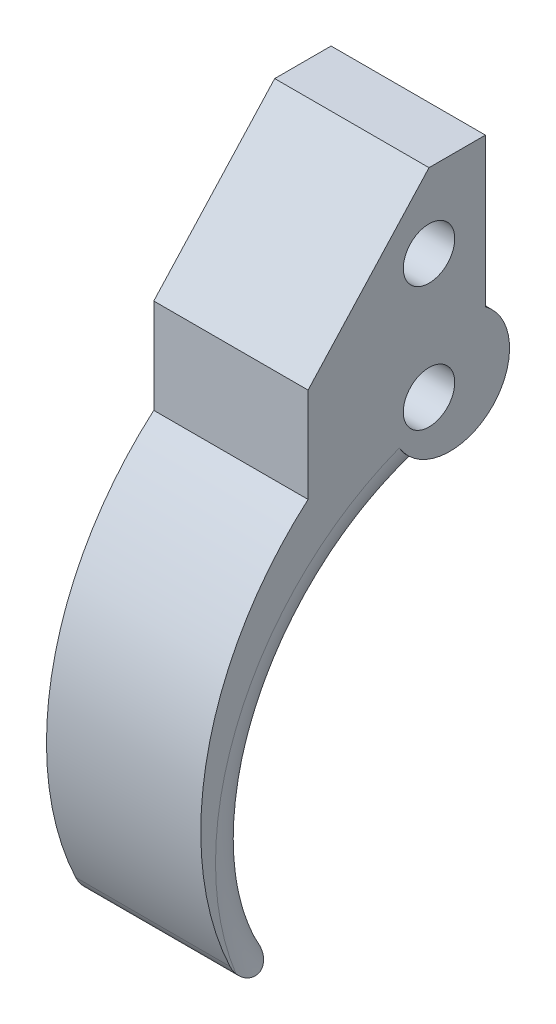
ISO-10303-21;
HEADER;
FILE_DESCRIPTION(('STEP AP214'),'2;1');
FILE_NAME('part.step','',(''),(''),'','','');
FILE_SCHEMA(('AUTOMOTIVE_DESIGN { 1 0 10303 214 1 1 1 1 }'));
ENDSEC;
DATA;
#1=APPLICATION_CONTEXT('core data for automotive mechanical design processes');
#2=APPLICATION_PROTOCOL_DEFINITION('international standard','automotive_design',2000,#1);
#3=PRODUCT_CONTEXT('',#1,'mechanical');
#4=PRODUCT('Part','Part','',(#3));
#5=PRODUCT_RELATED_PRODUCT_CATEGORY('part','',(#4));
#6=PRODUCT_DEFINITION_FORMATION('','',#4);
#7=PRODUCT_DEFINITION_CONTEXT('part definition',#1,'design');
#8=PRODUCT_DEFINITION('design','',#6,#7);
#9=PRODUCT_DEFINITION_SHAPE('','',#8);
#10=(LENGTH_UNIT() NAMED_UNIT(*) SI_UNIT(.MILLI.,.METRE.));
#11=(NAMED_UNIT(*) PLANE_ANGLE_UNIT() SI_UNIT($,.RADIAN.));
#12=(NAMED_UNIT(*) SI_UNIT($,.STERADIAN.) SOLID_ANGLE_UNIT());
#13=UNCERTAINTY_MEASURE_WITH_UNIT(LENGTH_MEASURE(1.E-05),#10,'distance_accuracy_value','');
#14=(GEOMETRIC_REPRESENTATION_CONTEXT(3) GLOBAL_UNCERTAINTY_ASSIGNED_CONTEXT((#13)) GLOBAL_UNIT_ASSIGNED_CONTEXT((#10,
#11,#12)) REPRESENTATION_CONTEXT('',''));
#15=CARTESIAN_POINT('',(0.,0.,0.));
#16=DIRECTION('',(0.,0.,1.));
#17=DIRECTION('',(1.,0.,0.));
#18=AXIS2_PLACEMENT_3D('',#15,#16,#17);
#19=CARTESIAN_POINT('',(9.144,0.406088351333503,-1.5095298454013));
#20=DIRECTION('',(-1.,0.,0.));
#21=DIRECTION('',(0.,0.,1.));
#22=AXIS2_PLACEMENT_3D('',#19,#20,#21);
#23=PLANE('',#22);
#24=CARTESIAN_POINT('',(9.144,-15.2659930238137,-5.07261330783147));
#25=DIRECTION('',(1.,0.,0.));
#26=DIRECTION('',(0.,0.,1.));
#27=AXIS2_PLACEMENT_3D('',#24,#25,#26);
#28=CIRCLE('',#27,18.3267874547555);
#29=CARTESIAN_POINT('',(9.144,-1.38815503928204,6.89721339462647));
#30=VERTEX_POINT('',#29);
#31=CARTESIAN_POINT('',(9.144,-23.0426955231033,11.5223870431576));
#32=VERTEX_POINT('',#31);
#33=EDGE_CURVE('E214',#30,#32,#28,.T.);
#34=ORIENTED_EDGE('',*,*,#33,.T.);
#35=CARTESIAN_POINT('',(9.144,-21.9648839100772,9.22240397217075));
#36=DIRECTION('',(-1.,0.,0.));
#37=DIRECTION('',(0.,0.,1.));
#38=AXIS2_PLACEMENT_3D('',#35,#36,#37);
#39=CIRCLE('',#38,2.54);
#40=CARTESIAN_POINT('',(9.144,-23.5895098556666,11.1748871441643));
#41=VERTEX_POINT('',#40);
#42=EDGE_CURVE('E159',#32,#41,#39,.F.);
#43=ORIENTED_EDGE('',*,*,#42,.T.);
#44=CARTESIAN_POINT('',(9.144,-17.3011498885334,-4.60291576796969));
#45=DIRECTION('',(-1.,0.,0.));
#46=DIRECTION('',(0.,0.,1.));
#47=AXIS2_PLACEMENT_3D('',#44,#45,#46);
#48=CIRCLE('',#47,16.9847736461334);
#49=CARTESIAN_POINT('',(9.144,-1.44900987596194,1.49562445344551));
#50=VERTEX_POINT('',#49);
#51=EDGE_CURVE('E141',#41,#50,#48,.T.);
#52=ORIENTED_EDGE('',*,*,#51,.T.);
#53=CARTESIAN_POINT('',(9.144,0.406088351333503,-1.5095298454013));
#54=DIRECTION('',(1.,0.,0.));
#55=DIRECTION('',(0.,0.,1.));
#56=AXIS2_PLACEMENT_3D('',#53,#54,#55);
#57=CIRCLE('',#56,3.53162027868119);
#58=CARTESIAN_POINT('',(9.144,3.24535103212137,-3.60975107714749));
#59=VERTEX_POINT('',#58);
#60=EDGE_CURVE('E135',#50,#59,#57,.T.);
#61=ORIENTED_EDGE('',*,*,#60,.T.);
#62=DIRECTION('',(0.,1.,0.));
#63=VECTOR('',#62,1.);
#64=CARTESIAN_POINT('',(9.144,12.0555386326772,-3.60975107714749));
#65=LINE('',#64,#63);
#66=CARTESIAN_POINT('',(9.144,12.0555386326772,-3.60975107714749));
#67=VERTEX_POINT('',#66);
#68=EDGE_CURVE('E124',#59,#67,#65,.T.);
#69=ORIENTED_EDGE('',*,*,#68,.T.);
#70=DIRECTION('',(0.,0.,1.));
#71=VECTOR('',#70,1.);
#72=CARTESIAN_POINT('',(9.144,12.0555386326772,-0.268270981163696));
#73=LINE('',#72,#71);
#74=CARTESIAN_POINT('',(9.144,12.0555386326772,-0.268270981163696));
#75=VERTEX_POINT('',#74);
#76=EDGE_CURVE('E134',#67,#75,#73,.T.);
#77=ORIENTED_EDGE('',*,*,#76,.T.);
#78=DIRECTION('',(0.,-0.737772650689594,0.67504926923481));
#79=VECTOR('',#78,1.);
#80=CARTESIAN_POINT('',(9.144,4.22426076551646,6.89721339462647));
#81=LINE('',#80,#79);
#82=CARTESIAN_POINT('',(9.144,4.22426076551646,6.89721339462647));
#83=VERTEX_POINT('',#82);
#84=EDGE_CURVE('E210',#75,#83,#81,.T.);
#85=ORIENTED_EDGE('',*,*,#84,.T.);
#86=DIRECTION('',(0.,-1.,0.));
#87=VECTOR('',#86,1.);
#88=CARTESIAN_POINT('',(9.144,-1.38815503928204,6.89721339462647));
#89=LINE('',#88,#87);
#90=EDGE_CURVE('E212',#83,#30,#89,.T.);
#91=ORIENTED_EDGE('',*,*,#90,.T.);
#92=EDGE_LOOP('',(#34,#43,#52,#61,#69,#77,#85,#91));
#93=FACE_BOUND('',#92,.T.);
#94=CARTESIAN_POINT('',(9.144,0.274790235043502,-0.268270981163696));
#95=DIRECTION('',(1.,0.,0.));
#96=DIRECTION('',(0.,0.,-1.));
#97=AXIS2_PLACEMENT_3D('',#94,#95,#96);
#98=CIRCLE('',#97,1.524);
#99=CARTESIAN_POINT('',(9.144,0.274790235043502,-1.79227098116369));
#100=VERTEX_POINT('',#99);
#101=EDGE_CURVE('E204',#100,#100,#98,.T.);
#102=ORIENTED_EDGE('',*,*,#101,.F.);
#103=EDGE_LOOP('',(#102));
#104=FACE_BOUND('',#103,.T.);
#105=CARTESIAN_POINT('',(9.144,7.65044483239927,-0.268270981163696));
#106=DIRECTION('',(1.,0.,0.));
#107=DIRECTION('',(0.,0.,-1.));
#108=AXIS2_PLACEMENT_3D('',#105,#106,#107);
#109=CIRCLE('',#108,1.524);
#110=CARTESIAN_POINT('',(9.144,7.65044483239927,-1.79227098116369));
#111=VERTEX_POINT('',#110);
#112=EDGE_CURVE('E196',#111,#111,#109,.T.);
#113=ORIENTED_EDGE('',*,*,#112,.F.);
#114=EDGE_LOOP('',(#113));
#115=FACE_BOUND('',#114,.T.);
#116=ADVANCED_FACE('F40',(#93,#104,#115),#23,.F.);
#117=CARTESIAN_POINT('',(0.,0.406088351333503,-1.5095298454013));
#118=DIRECTION('',(-1.,0.,0.));
#119=DIRECTION('',(0.,0.,1.));
#120=AXIS2_PLACEMENT_3D('',#117,#118,#119);
#121=PLANE('',#120);
#122=CARTESIAN_POINT('',(0.,0.274790235043502,-0.268270981163696));
#123=DIRECTION('',(1.,0.,0.));
#124=DIRECTION('',(0.,0.,-1.));
#125=AXIS2_PLACEMENT_3D('',#122,#123,#124);
#126=CIRCLE('',#125,1.524);
#127=CARTESIAN_POINT('',(0.,0.274790235043502,-1.79227098116369));
#128=VERTEX_POINT('',#127);
#129=EDGE_CURVE('E201',#128,#128,#126,.T.);
#130=ORIENTED_EDGE('',*,*,#129,.T.);
#131=EDGE_LOOP('',(#130));
#132=FACE_BOUND('',#131,.T.);
#133=CARTESIAN_POINT('',(0.,-17.3011498885334,-4.60291576796969));
#134=DIRECTION('',(-1.,0.,0.));
#135=DIRECTION('',(0.,0.,1.));
#136=AXIS2_PLACEMENT_3D('',#133,#134,#135);
#137=CIRCLE('',#136,16.9847736461334);
#138=CARTESIAN_POINT('',(0.,-1.44900987596194,1.49562445344551));
#139=VERTEX_POINT('',#138);
#140=CARTESIAN_POINT('',(0.,-23.5895098556666,11.1748871441643));
#141=VERTEX_POINT('',#140);
#142=EDGE_CURVE('E147',#139,#141,#137,.F.);
#143=ORIENTED_EDGE('',*,*,#142,.T.);
#144=CARTESIAN_POINT('',(0.,-21.9648839100772,9.22240397217075));
#145=DIRECTION('',(-1.,0.,0.));
#146=DIRECTION('',(0.,0.,1.));
#147=AXIS2_PLACEMENT_3D('',#144,#145,#146);
#148=CIRCLE('',#147,2.54);
#149=CARTESIAN_POINT('',(0.,-23.0426955231033,11.5223870431576));
#150=VERTEX_POINT('',#149);
#151=EDGE_CURVE('E149',#141,#150,#148,.T.);
#152=ORIENTED_EDGE('',*,*,#151,.T.);
#153=CARTESIAN_POINT('',(0.,-15.2659930238137,-5.07261330783147));
#154=DIRECTION('',(1.,0.,0.));
#155=DIRECTION('',(0.,0.,1.));
#156=AXIS2_PLACEMENT_3D('',#153,#154,#155);
#157=CIRCLE('',#156,18.3267874547555);
#158=CARTESIAN_POINT('',(0.,-1.38815503928204,6.89721339462647));
#159=VERTEX_POINT('',#158);
#160=EDGE_CURVE('E142',#159,#150,#157,.T.);
#161=ORIENTED_EDGE('',*,*,#160,.F.);
#162=DIRECTION('',(0.,-1.,0.));
#163=VECTOR('',#162,1.);
#164=CARTESIAN_POINT('',(0.,-1.38815503928204,6.89721339462647));
#165=LINE('',#164,#163);
#166=CARTESIAN_POINT('',(0.,4.22426076551646,6.89721339462647));
#167=VERTEX_POINT('',#166);
#168=EDGE_CURVE('E224',#167,#159,#165,.T.);
#169=ORIENTED_EDGE('',*,*,#168,.F.);
#170=DIRECTION('',(0.,-0.737772650689594,0.67504926923481));
#171=VECTOR('',#170,1.);
#172=CARTESIAN_POINT('',(0.,4.22426076551646,6.89721339462647));
#173=LINE('',#172,#171);
#174=CARTESIAN_POINT('',(0.,12.0555386326772,-0.268270981163696));
#175=VERTEX_POINT('',#174);
#176=EDGE_CURVE('E222',#175,#167,#173,.T.);
#177=ORIENTED_EDGE('',*,*,#176,.F.);
#178=DIRECTION('',(0.,0.,1.));
#179=VECTOR('',#178,1.);
#180=CARTESIAN_POINT('',(0.,12.0555386326772,-0.268270981163696));
#181=LINE('',#180,#179);
#182=CARTESIAN_POINT('',(0.,12.0555386326772,-3.60975107714749));
#183=VERTEX_POINT('',#182);
#184=EDGE_CURVE('E220',#183,#175,#181,.T.);
#185=ORIENTED_EDGE('',*,*,#184,.F.);
#186=DIRECTION('',(0.,1.,0.));
#187=VECTOR('',#186,1.);
#188=CARTESIAN_POINT('',(0.,12.0555386326772,-3.60975107714749));
#189=LINE('',#188,#187);
#190=CARTESIAN_POINT('',(0.,3.24535103212137,-3.60975107714749));
#191=VERTEX_POINT('',#190);
#192=EDGE_CURVE('E218',#191,#183,#189,.T.);
#193=ORIENTED_EDGE('',*,*,#192,.F.);
#194=CARTESIAN_POINT('',(0.,0.406088351333503,-1.5095298454013));
#195=DIRECTION('',(1.,0.,0.));
#196=DIRECTION('',(0.,0.,1.));
#197=AXIS2_PLACEMENT_3D('',#194,#195,#196);
#198=CIRCLE('',#197,3.53162027868119);
#199=EDGE_CURVE('E146',#139,#191,#198,.T.);
#200=ORIENTED_EDGE('',*,*,#199,.F.);
#201=EDGE_LOOP('',(#143,#152,#161,#169,#177,#185,#193,#200));
#202=FACE_BOUND('',#201,.T.);
#203=CARTESIAN_POINT('',(0.,7.65044483239927,-0.268270981163696));
#204=DIRECTION('',(1.,0.,0.));
#205=DIRECTION('',(0.,0.,-1.));
#206=AXIS2_PLACEMENT_3D('',#203,#204,#205);
#207=CIRCLE('',#206,1.524);
#208=CARTESIAN_POINT('',(0.,7.65044483239927,-1.79227098116369));
#209=VERTEX_POINT('',#208);
#210=EDGE_CURVE('E192',#209,#209,#207,.T.);
#211=ORIENTED_EDGE('',*,*,#210,.T.);
#212=EDGE_LOOP('',(#211));
#213=FACE_BOUND('',#212,.T.);
#214=ADVANCED_FACE('F247',(#132,#202,#213),#121,.T.);
#215=CARTESIAN_POINT('',(9.144,0.406088351333503,-1.5095298454013));
#216=DIRECTION('',(-1.,0.,0.));
#217=DIRECTION('',(0.,0.,1.));
#218=AXIS2_PLACEMENT_3D('',#215,#216,#217);
#219=CYLINDRICAL_SURFACE('',#218,3.53162027868119);
#220=ORIENTED_EDGE('',*,*,#199,.T.);
#221=DIRECTION('',(-1.,0.,0.));
#222=VECTOR('',#221,1.);
#223=CARTESIAN_POINT('',(9.144,3.24535103212137,-3.60975107714749));
#224=LINE('',#223,#222);
#225=EDGE_CURVE('E128',#59,#191,#224,.T.);
#226=ORIENTED_EDGE('',*,*,#225,.F.);
#227=ORIENTED_EDGE('',*,*,#60,.F.);
#228=CARTESIAN_POINT('',(9.144,-1.44900987596194,1.49562445344551));
#229=CARTESIAN_POINT('',(9.14401558479756,-1.50764499857951,1.45944839527737));
#230=CARTESIAN_POINT('',(9.141293185844,-1.56517981349432,1.42154355301967));
#231=CARTESIAN_POINT('',(9.13068728383137,-1.67756264777975,1.34273470485948));
#232=CARTESIAN_POINT('',(9.12281000365243,-1.73241382109675,1.30183436786638));
#233=CARTESIAN_POINT('',(9.10230978065374,-1.83855820875161,1.21782191592179));
#234=CARTESIAN_POINT('',(9.0897346168211,-1.88988128346272,1.17473572154905));
#235=CARTESIAN_POINT('',(9.06021452385428,-1.98930528084612,1.08640135210276));
#236=CARTESIAN_POINT('',(9.04326841324315,-2.03740532789118,1.04115259518197));
#237=CARTESIAN_POINT('',(8.98665374862367,-2.17614064666349,0.903217611340251));
#238=CARTESIAN_POINT('',(8.94108629071486,-2.26180413669485,0.807867651742743));
#239=CARTESIAN_POINT('',(8.83729217442203,-2.41957124930717,0.612695740845324));
#240=CARTESIAN_POINT('',(8.7790270783801,-2.49163243187795,0.512860958133193));
#241=CARTESIAN_POINT('',(8.61351413922286,-2.66322454181977,0.248215209081731));
#242=CARTESIAN_POINT('',(8.49827550133057,-2.75213590587142,0.0814484599525435));
#243=CARTESIAN_POINT('',(8.31316166682807,-2.86255307657508,-0.169122332027183));
#244=CARTESIAN_POINT('',(8.24933931310177,-2.89555687158692,-0.252806073127422));
#245=CARTESIAN_POINT('',(8.11834472389365,-2.95445385777348,-0.420059721321002));
#246=CARTESIAN_POINT('',(8.05117350005526,-2.98034918111554,-0.503629655050557));
#247=CARTESIAN_POINT('',(7.90150330762556,-3.02965349050061,-0.685814127974017));
#248=CARTESIAN_POINT('',(7.81846930279747,-3.05171413372965,-0.784348970002439));
#249=CARTESIAN_POINT('',(7.64975824672017,-3.08708700690639,-0.980408430450946));
#250=CARTESIAN_POINT('',(7.56408598388154,-3.10041420915622,-1.0779344941989));
#251=CARTESIAN_POINT('',(7.41960031617798,-3.1157981001766,-1.23957637032389));
#252=CARTESIAN_POINT('',(7.36135147916668,-3.120130698743,-1.30399439596895));
#253=CARTESIAN_POINT('',(7.24404335742369,-3.12527324817949,-1.43235953636838));
#254=CARTESIAN_POINT('',(7.18498330161318,-3.12607957577112,-1.49630609939151));
#255=CARTESIAN_POINT('',(7.08946281128831,-3.1246209456296,-1.59859174952146));
#256=CARTESIAN_POINT('',(7.05321255930118,-3.12343539281564,-1.63714906695725));
#257=CARTESIAN_POINT('',(6.98054495420218,-3.11982446926185,-1.71384750177172));
#258=CARTESIAN_POINT('',(6.94412839896399,-3.11740273170986,-1.75198950612995));
#259=CARTESIAN_POINT('',(6.88665541754642,-3.11267496513833,-1.81138738224479));
#260=CARTESIAN_POINT('',(6.86574640997158,-3.11076928166641,-1.8328330286069));
#261=CARTESIAN_POINT('',(6.82352843543219,-3.1065625283707,-1.87570262274625));
#262=CARTESIAN_POINT('',(6.80221760399473,-3.1042584005846,-1.89712500753151));
#263=CARTESIAN_POINT('',(6.75882886683068,-3.09934582279156,-1.93936098564496));
#264=CARTESIAN_POINT('',(6.7367451202631,-3.09673431959897,-1.9601653563002));
#265=CARTESIAN_POINT('',(6.69160140524234,-3.09124454335289,-2.00080310147611));
#266=CARTESIAN_POINT('',(6.66856970082351,-3.08837263154746,-2.02064756710389));
#267=CARTESIAN_POINT('',(6.63733419936244,-3.08610675942322,-2.03576382118885));
#268=CARTESIAN_POINT('',(6.63291820410454,-3.0858172936519,-2.03767731381979));
#269=CARTESIAN_POINT('',(6.62385414373573,-3.08534725340603,-2.04077473550392));
#270=CARTESIAN_POINT('',(6.61920816691246,-3.08516584390673,-2.04196426074975));
#271=CARTESIAN_POINT('',(6.61276271386998,-3.08501503823392,-2.04295182818701));
#272=CARTESIAN_POINT('',(6.61102344742284,-3.08498412905291,-2.04315403237203));
#273=CARTESIAN_POINT('',(6.60752320403836,-3.08494242257172,-2.04342676841837));
#274=CARTESIAN_POINT('',(6.60576215941354,-3.08493175590543,-2.04349644502717));
#275=CARTESIAN_POINT('',(6.60399999998301,-3.08493191051912,-2.04349550360743));
#276=B_SPLINE_CURVE_WITH_KNOTS('',3,(#228,#229,#230,#231,#232,#233,#234,#235,#236,#237,#238,
#239,#240,#241,#242,#243,#244,#245,#246,#247,#248,#249,#250,#251,#252,#253,#254,#255,#256,#257,
#258,#259,#260,#261,#262,#263,#264,#265,#266,#267,#268,#269,#270,#271,#272,#273,#274,#275),
.UNSPECIFIED.,.F.,.F.,(4,2,2,2,2,2,2,2,2,2,2,2,2,2,2,2,2,2,2,2,2,2,2,4),(0.,0.206563873198582,
0.412878845056729,0.61715025169804,0.821476931339174,1.2278494944651,1.63546973235267,
2.29548808693195,2.62620785781097,2.95682832150442,3.34867116532106,3.73984047791499,
4.0006409647124,4.26170936373281,4.42050695420632,4.57884049768053,4.66890406255317,
4.75969229222795,4.85147362601452,4.94142397055091,4.95584591143422,4.97015490741217,
4.97540417461807,4.98068720396929),.UNSPECIFIED.);
#277=CARTESIAN_POINT('',(6.604,-3.0849319105002,-2.04349550371534));
#278=VERTEX_POINT('',#277);
#279=EDGE_CURVE('E11',#50,#278,#276,.T.);
#280=ORIENTED_EDGE('',*,*,#279,.T.);
#281=DIRECTION('',(-1.,0.,0.));
#282=VECTOR('',#281,1.);
#283=CARTESIAN_POINT('',(9.144,-3.0849319105002,-2.04349550371534));
#284=LINE('',#283,#282);
#285=CARTESIAN_POINT('',(2.54,-3.0849319105002,-2.04349550371534));
#286=VERTEX_POINT('',#285);
#287=EDGE_CURVE('E216',#278,#286,#284,.T.);
#288=ORIENTED_EDGE('',*,*,#287,.T.);
#289=CARTESIAN_POINT('',(2.54,-3.0849319105002,-2.04349550371534));
#290=CARTESIAN_POINT('',(2.53535903796645,-3.08492778378608,-2.04352083046972));
#291=CARTESIAN_POINT('',(2.5307613962753,-3.08500474635934,-2.04301943028928));
#292=CARTESIAN_POINT('',(2.5218357603453,-3.0852787453084,-2.04122418026463));
#293=CARTESIAN_POINT('',(2.51750393872709,-3.08547284518064,-2.03994970664147));
#294=CARTESIAN_POINT('',(2.50435991268843,-3.08620421947048,-2.03511922927494));
#295=CARTESIAN_POINT('',(2.49593315318759,-3.08688289903912,-2.03060330594372));
#296=CARTESIAN_POINT('',(2.4796318139157,-3.08838253320247,-2.02045428823825));
#297=CARTESIAN_POINT('',(2.47177275587116,-3.08920620251877,-2.01479951079074));
#298=CARTESIAN_POINT('',(2.43042324031588,-3.09369544310606,-1.9833476090641));
#299=CARTESIAN_POINT('',(2.39984870139924,-3.09758000871505,-1.95391728578621));
#300=CARTESIAN_POINT('',(2.33962165665619,-3.10459179812853,-1.89476958420974));
#301=CARTESIAN_POINT('',(2.30996394103566,-3.10772450519859,-1.86505603693477));
#302=CARTESIAN_POINT('',(2.22162854250685,-3.11603334138825,-1.77515851804334));
#303=CARTESIAN_POINT('',(2.16356485977771,-3.12012349565845,-1.71419497150772));
#304=CARTESIAN_POINT('',(2.04795740489942,-3.12511588658202,-1.59164934343407));
#305=CARTESIAN_POINT('',(1.99041391635755,-3.12601647787671,-1.53006695908502));
#306=CARTESIAN_POINT('',(1.87574455351594,-3.12456001272882,-1.4060201378306));
#307=CARTESIAN_POINT('',(1.81862170334611,-3.12218834990843,-1.34355298591576));
#308=CARTESIAN_POINT('',(1.7051484151036,-3.11405270123369,-1.21815089282931));
#309=CARTESIAN_POINT('',(1.64879796665444,-3.10828876099712,-1.15521595795946));
#310=CARTESIAN_POINT('',(1.49523308893339,-3.08763043795068,-0.98167334118333));
#311=CARTESIAN_POINT('',(1.39897672433372,-3.06913147826561,-0.870614534705762));
#312=CARTESIAN_POINT('',(1.21044708462399,-3.0206122101847,-0.647491422661421));
#313=CARTESIAN_POINT('',(1.11817621266706,-2.99058505555532,-0.535426558324071));
#314=CARTESIAN_POINT('',(0.93947589723088,-2.91810529923088,-0.311235073833958));
#315=CARTESIAN_POINT('',(0.853028039944875,-2.87569437109094,-0.199109899691097));
#316=CARTESIAN_POINT('',(0.687683709110436,-2.7772567330273,0.0246045929939428));
#317=CARTESIAN_POINT('',(0.608778510190756,-2.7212460276571,0.136194385318564));
#318=CARTESIAN_POINT('',(0.460408683120308,-2.59384738607016,0.358423332681394));
#319=CARTESIAN_POINT('',(0.391016278669495,-2.52235141543026,0.469049819329106));
#320=CARTESIAN_POINT('',(0.265727147108217,-2.36314222580771,0.686326966179542));
#321=CARTESIAN_POINT('',(0.209820732697335,-2.27544072808726,0.792980433447853));
#322=CARTESIAN_POINT('',(0.12125548629817,-2.09534295218264,0.986561859687355));
#323=CARTESIAN_POINT('',(0.0865922115697584,-2.00482573395197,1.07430867163122));
#324=CARTESIAN_POINT('',(0.0336779334462466,-1.81215986850952,1.2414441054057));
#325=CARTESIAN_POINT('',(0.0153830165960186,-1.71004317623963,1.32085458324559));
#326=CARTESIAN_POINT('',(0.0042858604541567,-1.57819103514575,1.41210226123763));
#327=CARTESIAN_POINT('',(0.00268329080096878,-1.55267267851716,1.42927088884619));
#328=CARTESIAN_POINT('',(0.000541497704210179,-1.50117923873015,1.46294592276135));
#329=CARTESIAN_POINT('',(1.68282485540863E-06,-1.47520441772511,1.47945269238611));
#330=CARTESIAN_POINT('',(0.,-1.44900987596194,1.49562445344551));
#331=B_SPLINE_CURVE_WITH_KNOTS('',3,(#289,#290,#291,#292,#293,#294,#295,#296,#297,#298,#299,
#300,#301,#302,#303,#304,#305,#306,#307,#308,#309,#310,#311,#312,#313,#314,#315,#316,#317,#318,
#319,#320,#321,#322,#323,#324,#325,#326,#327,#328,#329,#330),.UNSPECIFIED.,.F.,.F.,(4,2,2,2,2,2,
2,2,2,2,2,2,2,2,2,2,2,2,2,2,4),(0.,0.0138269480210966,0.0273208872898445,0.0558492094184924,
0.0849832160923829,0.212340580744305,0.338738809554138,0.591436109373146,0.844263745913024,
1.09822358890352,1.35218001683731,1.79607258642084,2.24022917867305,2.68290800128248,
3.1250683721918,3.57041903362345,4.01544883027974,4.40616883172213,4.79583742860322,
4.88821313071472,4.98053741009144),.UNSPECIFIED.);
#332=EDGE_CURVE('E55',#286,#139,#331,.T.);
#333=ORIENTED_EDGE('',*,*,#332,.T.);
#334=EDGE_LOOP('',(#220,#226,#227,#280,#288,#333));
#335=FACE_BOUND('',#334,.T.);
#336=ADVANCED_FACE('F144',(#335),#219,.T.);
#337=CARTESIAN_POINT('',(9.144,12.0555386326772,-3.60975107714749));
#338=DIRECTION('',(0.,0.,1.));
#339=DIRECTION('',(0.,-1.,0.));
#340=AXIS2_PLACEMENT_3D('',#337,#338,#339);
#341=PLANE('',#340);
#342=ORIENTED_EDGE('',*,*,#192,.T.);
#343=DIRECTION('',(-1.,0.,0.));
#344=VECTOR('',#343,1.);
#345=CARTESIAN_POINT('',(9.144,12.0555386326772,-3.60975107714749));
#346=LINE('',#345,#344);
#347=EDGE_CURVE('E131',#67,#183,#346,.T.);
#348=ORIENTED_EDGE('',*,*,#347,.F.);
#349=ORIENTED_EDGE('',*,*,#68,.F.);
#350=ORIENTED_EDGE('',*,*,#225,.T.);
#351=EDGE_LOOP('',(#342,#348,#349,#350));
#352=FACE_BOUND('',#351,.T.);
#353=ADVANCED_FACE('F126',(#352),#341,.F.);
#354=CARTESIAN_POINT('',(9.144,12.0555386326772,-0.268270981163696));
#355=DIRECTION('',(0.,-1.,0.));
#356=DIRECTION('',(0.,0.,-1.));
#357=AXIS2_PLACEMENT_3D('',#354,#355,#356);
#358=PLANE('',#357);
#359=ORIENTED_EDGE('',*,*,#184,.T.);
#360=DIRECTION('',(-1.,0.,0.));
#361=VECTOR('',#360,1.);
#362=CARTESIAN_POINT('',(9.144,12.0555386326772,-0.268270981163696));
#363=LINE('',#362,#361);
#364=EDGE_CURVE('E151',#75,#175,#363,.T.);
#365=ORIENTED_EDGE('',*,*,#364,.F.);
#366=ORIENTED_EDGE('',*,*,#76,.F.);
#367=ORIENTED_EDGE('',*,*,#347,.T.);
#368=EDGE_LOOP('',(#359,#365,#366,#367));
#369=FACE_BOUND('',#368,.T.);
#370=ADVANCED_FACE('F287',(#369),#358,.F.);
#371=CARTESIAN_POINT('',(9.144,4.22426076551646,6.89721339462647));
#372=DIRECTION('',(0.,-0.67504926923481,-0.737772650689594));
#373=DIRECTION('',(0.,0.737772650689594,-0.67504926923481));
#374=AXIS2_PLACEMENT_3D('',#371,#372,#373);
#375=PLANE('',#374);
#376=ORIENTED_EDGE('',*,*,#176,.T.);
#377=DIRECTION('',(-1.,0.,0.));
#378=VECTOR('',#377,1.);
#379=CARTESIAN_POINT('',(9.144,4.22426076551646,6.89721339462647));
#380=LINE('',#379,#378);
#381=EDGE_CURVE('E234',#83,#167,#380,.T.);
#382=ORIENTED_EDGE('',*,*,#381,.F.);
#383=ORIENTED_EDGE('',*,*,#84,.F.);
#384=ORIENTED_EDGE('',*,*,#364,.T.);
#385=EDGE_LOOP('',(#376,#382,#383,#384));
#386=FACE_BOUND('',#385,.T.);
#387=ADVANCED_FACE('F241',(#386),#375,.F.);
#388=CARTESIAN_POINT('',(9.144,-1.38815503928204,6.89721339462647));
#389=DIRECTION('',(0.,0.,-1.));
#390=DIRECTION('',(-1.,0.,0.));
#391=AXIS2_PLACEMENT_3D('',#388,#389,#390);
#392=PLANE('',#391);
#393=ORIENTED_EDGE('',*,*,#168,.T.);
#394=DIRECTION('',(-1.,0.,0.));
#395=VECTOR('',#394,1.);
#396=CARTESIAN_POINT('',(9.144,-1.38815503928204,6.89721339462647));
#397=LINE('',#396,#395);
#398=EDGE_CURVE('E231',#30,#159,#397,.T.);
#399=ORIENTED_EDGE('',*,*,#398,.F.);
#400=ORIENTED_EDGE('',*,*,#90,.F.);
#401=ORIENTED_EDGE('',*,*,#381,.T.);
#402=EDGE_LOOP('',(#393,#399,#400,#401));
#403=FACE_BOUND('',#402,.T.);
#404=ADVANCED_FACE('F251',(#403),#392,.F.);
#405=CARTESIAN_POINT('',(9.144,-15.2659930238137,-5.07261330783147));
#406=DIRECTION('',(-1.,0.,0.));
#407=DIRECTION('',(0.,0.,1.));
#408=AXIS2_PLACEMENT_3D('',#405,#406,#407);
#409=CYLINDRICAL_SURFACE('',#408,18.3267874547555);
#410=ORIENTED_EDGE('',*,*,#160,.T.);
#411=DIRECTION('',(-1.,0.,0.));
#412=VECTOR('',#411,1.);
#413=CARTESIAN_POINT('',(9.144,-23.0426955231033,11.5223870431576));
#414=LINE('',#413,#412);
#415=EDGE_CURVE('E156',#150,#32,#414,.F.);
#416=ORIENTED_EDGE('',*,*,#415,.T.);
#417=ORIENTED_EDGE('',*,*,#33,.F.);
#418=ORIENTED_EDGE('',*,*,#398,.T.);
#419=EDGE_LOOP('',(#410,#416,#417,#418));
#420=FACE_BOUND('',#419,.T.);
#421=ADVANCED_FACE('F255',(#420),#409,.T.);
#422=CARTESIAN_POINT('',(9.144,-17.3011498885334,-4.60291576796969));
#423=DIRECTION('',(-1.,0.,0.));
#424=DIRECTION('',(0.,0.,1.));
#425=AXIS2_PLACEMENT_3D('',#422,#423,#424);
#426=CYLINDRICAL_SURFACE('',#425,14.4447736461334);
#427=DIRECTION('',(-1.,0.,0.));
#428=VECTOR('',#427,1.);
#429=CARTESIAN_POINT('',(9.144,-24.2293821518341,8.07190507470057));
#430=LINE('',#429,#428);
#431=CARTESIAN_POINT('',(6.604,-24.2293821518341,8.07190507470057));
#432=VERTEX_POINT('',#431);
#433=CARTESIAN_POINT('',(2.54,-24.2293821518341,8.07190507470057));
#434=VERTEX_POINT('',#433);
#435=EDGE_CURVE('E229',#432,#434,#430,.T.);
#436=ORIENTED_EDGE('',*,*,#435,.T.);
#437=CARTESIAN_POINT('',(2.54,-17.3011498885334,-4.60291576796969));
#438=DIRECTION('',(-1.,0.,0.));
#439=DIRECTION('',(0.,0.,1.));
#440=AXIS2_PLACEMENT_3D('',#437,#438,#439);
#441=CIRCLE('',#440,14.4447736461334);
#442=EDGE_CURVE('E63',#434,#286,#441,.T.);
#443=ORIENTED_EDGE('',*,*,#442,.T.);
#444=ORIENTED_EDGE('',*,*,#287,.F.);
#445=CARTESIAN_POINT('',(6.604,-17.3011498885334,-4.60291576796969));
#446=DIRECTION('',(-1.,0.,0.));
#447=DIRECTION('',(0.,0.,1.));
#448=AXIS2_PLACEMENT_3D('',#445,#446,#447);
#449=CIRCLE('',#448,14.4447736461334);
#450=EDGE_CURVE('E161',#278,#432,#449,.F.);
#451=ORIENTED_EDGE('',*,*,#450,.T.);
#452=EDGE_LOOP('',(#436,#443,#444,#451));
#453=FACE_BOUND('',#452,.T.);
#454=ADVANCED_FACE('F259',(#453),#426,.F.);
#455=CARTESIAN_POINT('',(9.144,0.274790235043502,-0.268270981163696));
#456=DIRECTION('',(-1.,0.,0.));
#457=DIRECTION('',(0.,0.,1.));
#458=AXIS2_PLACEMENT_3D('',#455,#456,#457);
#459=CYLINDRICAL_SURFACE('',#458,1.524);
#460=ORIENTED_EDGE('',*,*,#101,.T.);
#461=EDGE_LOOP('',(#460));
#462=FACE_BOUND('',#461,.T.);
#463=ORIENTED_EDGE('',*,*,#129,.F.);
#464=EDGE_LOOP('',(#463));
#465=FACE_BOUND('',#464,.T.);
#466=ADVANCED_FACE('F267',(#462,#465),#459,.F.);
#467=CARTESIAN_POINT('',(9.144,7.65044483239927,-0.268270981163696));
#468=DIRECTION('',(-1.,0.,0.));
#469=DIRECTION('',(0.,0.,1.));
#470=AXIS2_PLACEMENT_3D('',#467,#468,#469);
#471=CYLINDRICAL_SURFACE('',#470,1.524);
#472=ORIENTED_EDGE('',*,*,#112,.T.);
#473=EDGE_LOOP('',(#472));
#474=FACE_BOUND('',#473,.T.);
#475=ORIENTED_EDGE('',*,*,#210,.F.);
#476=EDGE_LOOP('',(#475));
#477=FACE_BOUND('',#476,.T.);
#478=ADVANCED_FACE('F263',(#474,#477),#471,.F.);
#479=CARTESIAN_POINT('',(6.604,-17.3011498885334,-4.60291576796969));
#480=DIRECTION('',(-1.,0.,0.));
#481=DIRECTION('',(0.,0.,1.));
#482=AXIS2_PLACEMENT_3D('',#479,#480,#481);
#483=TOROIDAL_SURFACE('',#482,16.9847736461334,2.54);
#484=ORIENTED_EDGE('',*,*,#279,.F.);
#485=ORIENTED_EDGE('',*,*,#51,.F.);
#486=CARTESIAN_POINT('',(9.144,-23.5895098556666,11.1748871441643));
#487=CARTESIAN_POINT('',(9.14399015151607,-23.6412351295287,11.1318566560687));
#488=CARTESIAN_POINT('',(9.14374359382497,-23.6912445280144,11.0867579088595));
#489=CARTESIAN_POINT('',(9.14238222524316,-23.7875371477769,10.9927303030428));
#490=CARTESIAN_POINT('',(9.14126716463185,-23.8338192931328,10.943800346488));
#491=CARTESIAN_POINT('',(9.1377656769979,-23.9225312427476,10.8422146895407));
#492=CARTESIAN_POINT('',(9.13537357368805,-23.964942849653,10.7895432721838));
#493=CARTESIAN_POINT('',(9.12885056867966,-24.0453843769479,10.6810595975787));
#494=CARTESIAN_POINT('',(9.12471983217348,-24.0834147131769,10.6252476391584));
#495=CARTESIAN_POINT('',(9.11420190049891,-24.1549476762063,10.5107334479154));
#496=CARTESIAN_POINT('',(9.10780733135179,-24.1884350060405,10.4520223159298));
#497=CARTESIAN_POINT('',(9.09223125100625,-24.2504949408116,10.3324131447841));
#498=CARTESIAN_POINT('',(9.08305001309989,-24.2790680272642,10.2715153205918));
#499=CARTESIAN_POINT('',(9.0613867845758,-24.3310575689971,10.1482992356282));
#500=CARTESIAN_POINT('',(9.04891291269641,-24.3544864517013,10.0859848085415));
#501=CARTESIAN_POINT('',(9.02013980480132,-24.3961721132804,9.96051362614743));
#502=CARTESIAN_POINT('',(9.00384103937248,-24.4144295278055,9.89735697536196));
#503=CARTESIAN_POINT('',(8.96841031320106,-24.4445539542492,9.77596993774839));
#504=CARTESIAN_POINT('',(8.94960098950445,-24.4568099714428,9.71774183586411));
#505=CARTESIAN_POINT('',(8.90805643329006,-24.4770589452781,9.60192164838939));
#506=CARTESIAN_POINT('',(8.88531989859609,-24.4850504843075,9.54432978052065));
#507=CARTESIAN_POINT('',(8.83574425829834,-24.4969879686878,9.43053613667042));
#508=CARTESIAN_POINT('',(8.8089071342732,-24.5009358610395,9.3743337044144));
#509=CARTESIAN_POINT('',(8.75105310287467,-24.5051454490933,9.26397193233016));
#510=CARTESIAN_POINT('',(8.72003472975072,-24.5054058487226,9.20981331752905));
#511=CARTESIAN_POINT('',(8.62744161141498,-24.5015901027504,9.0620848974547));
#512=CARTESIAN_POINT('',(8.56119803679026,-24.4938969967318,8.97146030849408));
#513=CARTESIAN_POINT('',(8.41635850104509,-24.4712932837691,8.80184137369686));
#514=CARTESIAN_POINT('',(8.33776032836843,-24.4563813836163,8.72284911503851));
#515=CARTESIAN_POINT('',(8.16704113140302,-24.4223366446256,8.57553002303934));
#516=CARTESIAN_POINT('',(8.07454503427268,-24.4030751091607,8.50766933352643));
#517=CARTESIAN_POINT('',(7.88041846986519,-24.3643123240165,8.38670754033728));
#518=CARTESIAN_POINT('',(7.77878350004428,-24.3448109603081,8.33361376534103));
#519=CARTESIAN_POINT('',(7.55538957431556,-24.3063691614261,8.23643870202324));
#520=CARTESIAN_POINT('',(7.4327064946408,-24.2878069416979,8.19432745398026));
#521=CARTESIAN_POINT('',(7.18169657120388,-24.2575219062771,8.12845400512026));
#522=CARTESIAN_POINT('',(7.05336775910502,-24.2458014965726,8.10469825824184));
#523=CARTESIAN_POINT('',(6.78378668237884,-24.2305495746326,8.07405902305464));
#524=CARTESIAN_POINT('',(6.64231970931036,-24.2277453462414,8.06867152136103));
#525=CARTESIAN_POINT('',(6.36033870520809,-24.2328988942382,8.07884261069892));
#526=CARTESIAN_POINT('',(6.21982490970541,-24.2408592397122,8.09440620193893));
#527=CARTESIAN_POINT('',(5.94199095580625,-24.2662246399413,8.14709108405756));
#528=CARTESIAN_POINT('',(5.80472573237739,-24.283736715132,8.18445699194286));
#529=CARTESIAN_POINT('',(5.60569326721015,-24.3144502686814,8.25710331228544));
#530=CARTESIAN_POINT('',(5.540451170205,-24.3254380452176,8.28410910162799));
#531=CARTESIAN_POINT('',(5.41274082476708,-24.348269231236,8.34371275835693));
#532=CARTESIAN_POINT('',(5.35027125650809,-24.360112226393,8.37630792825607));
#533=CARTESIAN_POINT('',(5.22983477589849,-24.3837130456924,8.44638673247007));
#534=CARTESIAN_POINT('',(5.17180281380184,-24.3954678390697,8.48375960745095));
#535=CARTESIAN_POINT('',(5.05941011915688,-24.4183625003759,8.56378912303222));
#536=CARTESIAN_POINT('',(5.00504745857877,-24.4295026906762,8.60644295483393));
#537=CARTESIAN_POINT('',(4.90049623193624,-24.4503429356361,8.69681791767401));
#538=CARTESIAN_POINT('',(4.8503036622852,-24.4600443787901,8.74453408587531));
#539=CARTESIAN_POINT('',(4.75448387158852,-24.4771613676817,8.8447240839497));
#540=CARTESIAN_POINT('',(4.70885590890196,-24.4845772851721,8.89719713829154));
#541=CARTESIAN_POINT('',(4.62734388569397,-24.4956235599975,9.00028662521119));
#542=CARTESIAN_POINT('',(4.5909406314246,-24.4995837765932,9.05045787070079));
#543=CARTESIAN_POINT('',(4.52218586320052,-24.5044794891525,9.15367242250536));
#544=CARTESIAN_POINT('',(4.48983567105355,-24.5054140008115,9.20671665773995));
#545=CARTESIAN_POINT('',(4.42930519823491,-24.5037711260744,9.31503172380724));
#546=CARTESIAN_POINT('',(4.40112170134737,-24.5011964642164,9.37030079494663));
#547=CARTESIAN_POINT('',(4.34885329191312,-24.492165670235,9.48244418792516));
#548=CARTESIAN_POINT('',(4.32476986609803,-24.4857081339682,9.53931908337568));
#549=CARTESIAN_POINT('',(4.26288272897717,-24.4617717506644,9.69988922424784));
#550=CARTESIAN_POINT('',(4.22950633529272,-24.4396089528581,9.80465834589609));
#551=CARTESIAN_POINT('',(4.17402640766023,-24.3811023838003,10.013128672108));
#552=CARTESIAN_POINT('',(4.15192583110589,-24.3447548966302,10.1168295895251));
#553=CARTESIAN_POINT('',(4.11587850793604,-24.2562212041497,10.3245350221692));
#554=CARTESIAN_POINT('',(4.10235422296449,-24.2033825680821,10.4283335086874));
#555=CARTESIAN_POINT('',(4.08235000345147,-24.0836145558438,10.6281698266912));
#556=CARTESIAN_POINT('',(4.07587311525089,-24.0166791010257,10.724204285471));
#557=CARTESIAN_POINT('',(4.06687083298204,-23.8612130571322,10.9173070763822));
#558=CARTESIAN_POINT('',(4.06491984193844,-23.7710480516665,11.0130886511899));
#559=CARTESIAN_POINT('',(4.06361018993331,-23.5769989023794,11.189613355));
#560=CARTESIAN_POINT('',(4.06425266472811,-23.4731087671808,11.2703498791294));
#561=CARTESIAN_POINT('',(4.06598646962371,-23.2456426653355,11.4204056319343));
#562=CARTESIAN_POINT('',(4.06710857566535,-23.1211666090563,11.4883654522443));
#563=CARTESIAN_POINT('',(4.06829009913283,-22.8626534036601,11.6026527316595));
#564=CARTESIAN_POINT('',(4.06834952249892,-22.7286163079922,11.6489803116847));
#565=CARTESIAN_POINT('',(4.06733761641434,-22.4533477905236,11.7190792725586));
#566=CARTESIAN_POINT('',(4.06625489491524,-22.3120575164909,11.7426188282975));
#567=CARTESIAN_POINT('',(4.06435801117125,-22.0274492040333,11.7656379439935));
#568=CARTESIAN_POINT('',(4.06354385011149,-21.884131156663,11.7651173977775));
#569=CARTESIAN_POINT('',(4.06463432933396,-21.67089514421,11.7463469819042));
#570=CARTESIAN_POINT('',(4.06538399760862,-21.6000740750294,11.7370833998806));
#571=CARTESIAN_POINT('',(4.06813006972892,-21.4594728343581,11.7126336912912));
#572=CARTESIAN_POINT('',(4.07012633315974,-21.3896925465413,11.6974482318303));
#573=CARTESIAN_POINT('',(4.07588760618928,-21.2516043300926,11.6612423557734));
#574=CARTESIAN_POINT('',(4.07965570690951,-21.1832991936713,11.6402117681766));
#575=CARTESIAN_POINT('',(4.0895539049819,-21.0488156590709,11.5925366961341));
#576=CARTESIAN_POINT('',(4.09568526316825,-20.9826384166098,11.565889218436));
#577=CARTESIAN_POINT('',(4.10329276380544,-20.9178260646304,11.5365495743938));
#578=B_SPLINE_CURVE_WITH_KNOTS('',3,(#486,#487,#488,#489,#490,#491,#492,#493,#494,#495,#496,
#497,#498,#499,#500,#501,#502,#503,#504,#505,#506,#507,#508,#509,#510,#511,#512,#513,#514,#515,
#516,#517,#518,#519,#520,#521,#522,#523,#524,#525,#526,#527,#528,#529,#530,#531,#532,#533,#534,
#535,#536,#537,#538,#539,#540,#541,#542,#543,#544,#545,#546,#547,#548,#549,#550,#551,#552,#553,
#554,#555,#556,#557,#558,#559,#560,#561,#562,#563,#564,#565,#566,#567,#568,#569,#570,#571,#572,
#573,#574,#575,#576,#577),.UNSPECIFIED.,.F.,.F.,(4,2,2,2,2,2,2,2,2,2,2,2,2,2,2,2,2,2,2,2,2,2,2,
2,2,2,2,2,2,2,2,2,2,2,2,2,2,2,2,2,2,2,2,2,2,4),(0.,0.20180417501921,0.403666396213996,
0.606433431525946,0.809181205727259,1.0125955600236,1.21598997166394,1.41888747838134,
1.62176003515278,1.80871484214607,1.99573175863267,2.18265858478321,2.36965110998491,
2.7054927174315,3.04139451139392,3.38897164146331,3.7367209642136,4.12815535849187,
4.51972732163204,4.94251456350137,5.36540272608218,5.79312940314188,6.007285207432,
6.22133794752226,6.43111129290017,6.64077354096605,6.85023211442539,7.05965660034752,
7.24573361135881,7.43187114977153,7.61786425245475,7.80392465532687,8.13875951853273,
8.47368215631959,8.82403163786915,9.17453250304302,9.56753565927985,9.96071094203054,
10.3841869226479,10.8076605360889,11.2353982825592,11.6631379165676,11.8772072082511,
12.0912523918033,12.3056723888233,12.5202069409066),.UNSPECIFIED.);
#579=EDGE_CURVE('E45',#432,#41,#578,.F.);
#580=ORIENTED_EDGE('',*,*,#579,.F.);
#581=ORIENTED_EDGE('',*,*,#450,.F.);
#582=EDGE_LOOP('',(#484,#485,#580,#581));
#583=FACE_BOUND('',#582,.T.);
#584=ADVANCED_FACE('F42',(#583),#483,.T.);
#585=CARTESIAN_POINT('',(2.54,-17.3011498885334,-4.60291576796969));
#586=DIRECTION('',(-1.,0.,0.));
#587=DIRECTION('',(0.,0.,1.));
#588=AXIS2_PLACEMENT_3D('',#585,#586,#587);
#589=TOROIDAL_SURFACE('',#588,16.9847736461334,2.54);
#590=ORIENTED_EDGE('',*,*,#332,.F.);
#591=ORIENTED_EDGE('',*,*,#442,.F.);
#592=CARTESIAN_POINT('',(0.,-23.5895098556666,11.1748871441643));
#593=CARTESIAN_POINT('',(9.84848393034122E-06,-23.6412351295287,11.1318566560687));
#594=CARTESIAN_POINT('',(0.000256406175025928,-23.6912445280144,11.0867579088595));
#595=CARTESIAN_POINT('',(0.00161777475683449,-23.7875371477769,10.9927303030428));
#596=CARTESIAN_POINT('',(0.00273283536815456,-23.8338192931328,10.943800346488));
#597=CARTESIAN_POINT('',(0.00623432300209825,-23.9225312427476,10.8422146895407));
#598=CARTESIAN_POINT('',(0.00862642631194966,-23.964942849653,10.7895432721838));
#599=CARTESIAN_POINT('',(0.0151494313203369,-24.0453843769479,10.6810595975787));
#600=CARTESIAN_POINT('',(0.0192801678265142,-24.0834147131769,10.6252476391584));
#601=CARTESIAN_POINT('',(0.0297980995010896,-24.1549476762063,10.5107334479154));
#602=CARTESIAN_POINT('',(0.0361926686482064,-24.1884350060405,10.4520223159298));
#603=CARTESIAN_POINT('',(0.0517687489937473,-24.2504949408116,10.3324131447841));
#604=CARTESIAN_POINT('',(0.0609499869001057,-24.2790680272642,10.2715153205918));
#605=CARTESIAN_POINT('',(0.0826132154242027,-24.3310575689971,10.1482992356282));
#606=CARTESIAN_POINT('',(0.0950870873035933,-24.3544864517013,10.0859848085415));
#607=CARTESIAN_POINT('',(0.123860195198679,-24.3961721132804,9.96051362614743));
#608=CARTESIAN_POINT('',(0.140158960627522,-24.4144295278055,9.89735697536196));
#609=CARTESIAN_POINT('',(0.175589686798939,-24.4445539542492,9.77596993774839));
#610=CARTESIAN_POINT('',(0.194399010495551,-24.4568099714428,9.71774183586411));
#611=CARTESIAN_POINT('',(0.235943566709938,-24.4770589452781,9.60192164838939));
#612=CARTESIAN_POINT('',(0.258680101403911,-24.4850504843075,9.54432978052065));
#613=CARTESIAN_POINT('',(0.308255741701656,-24.4969879686878,9.43053613667042));
#614=CARTESIAN_POINT('',(0.335092865726798,-24.5009358610395,9.3743337044144));
#615=CARTESIAN_POINT('',(0.392946897125335,-24.5051454490933,9.26397193233016));
#616=CARTESIAN_POINT('',(0.423965270249283,-24.5054058487226,9.20981331752905));
#617=CARTESIAN_POINT('',(0.516558388585016,-24.5015901027504,9.0620848974547));
#618=CARTESIAN_POINT('',(0.582801963209745,-24.4938969967318,8.97146030849408));
#619=CARTESIAN_POINT('',(0.72764149895491,-24.4712932837691,8.80184137369686));
#620=CARTESIAN_POINT('',(0.806239671631568,-24.4563813836163,8.72284911503851));
#621=CARTESIAN_POINT('',(0.976958868596971,-24.4223366446256,8.57553002303934));
#622=CARTESIAN_POINT('',(1.06945496572732,-24.4030751091607,8.50766933352643));
#623=CARTESIAN_POINT('',(1.26358153013481,-24.3643123240165,8.38670754033728));
#624=CARTESIAN_POINT('',(1.36521649995571,-24.3448109603081,8.33361376534103));
#625=CARTESIAN_POINT('',(1.58861042568444,-24.3063691614261,8.23643870202324));
#626=CARTESIAN_POINT('',(1.7112935053592,-24.2878069416979,8.19432745398026));
#627=CARTESIAN_POINT('',(1.96230342879612,-24.2575219062771,8.12845400512026));
#628=CARTESIAN_POINT('',(2.09063224089498,-24.2458014965726,8.10469825824184));
#629=CARTESIAN_POINT('',(2.36021331762116,-24.2305495746326,8.07405902305464));
#630=CARTESIAN_POINT('',(2.50168029068964,-24.2277453462414,8.06867152136103));
#631=CARTESIAN_POINT('',(2.78366129479191,-24.2328988942382,8.07884261069892));
#632=CARTESIAN_POINT('',(2.92417509029459,-24.2408592397122,8.09440620193894));
#633=CARTESIAN_POINT('',(3.20200904419375,-24.2662246399413,8.14709108405755));
#634=CARTESIAN_POINT('',(3.3392742676226,-24.283736715132,8.18445699194286));
#635=CARTESIAN_POINT('',(3.53830673278985,-24.3144502686814,8.25710331228544));
#636=CARTESIAN_POINT('',(3.603548829795,-24.3254380452176,8.28410910162799));
#637=CARTESIAN_POINT('',(3.73125917523292,-24.348269231236,8.34371275835693));
#638=CARTESIAN_POINT('',(3.79372874349191,-24.360112226393,8.37630792825608));
#639=CARTESIAN_POINT('',(3.91416522410151,-24.3837130456924,8.44638673247007));
#640=CARTESIAN_POINT('',(3.97219718619816,-24.3954678390697,8.48375960745095));
#641=CARTESIAN_POINT('',(4.08458988084312,-24.4183625003759,8.56378912303222));
#642=CARTESIAN_POINT('',(4.13895254142123,-24.4295026906762,8.60644295483393));
#643=CARTESIAN_POINT('',(4.24350376806376,-24.4503429356361,8.69681791767401));
#644=CARTESIAN_POINT('',(4.2936963377148,-24.4600443787901,8.7445340858753));
#645=CARTESIAN_POINT('',(4.38951612841148,-24.4771613676817,8.8447240839497));
#646=CARTESIAN_POINT('',(4.43514409109804,-24.4845772851721,8.89719713829154));
#647=CARTESIAN_POINT('',(4.51665611430603,-24.4956235599975,9.00028662521119));
#648=CARTESIAN_POINT('',(4.5530593685754,-24.4995837765932,9.05045787070079));
#649=CARTESIAN_POINT('',(4.62181413679948,-24.5044794891525,9.15367242250536));
#650=CARTESIAN_POINT('',(4.65416432894645,-24.5054140008115,9.20671665773994));
#651=CARTESIAN_POINT('',(4.71469480176509,-24.5037711260744,9.31503172380724));
#652=CARTESIAN_POINT('',(4.74287829865263,-24.5011964642164,9.37030079494663));
#653=CARTESIAN_POINT('',(4.79514670808688,-24.492165670235,9.48244418792517));
#654=CARTESIAN_POINT('',(4.81923013390197,-24.4857081339682,9.53931908337568));
#655=CARTESIAN_POINT('',(4.88111727102283,-24.4617717506644,9.69988922424784));
#656=CARTESIAN_POINT('',(4.91449366470728,-24.4396089528581,9.80465834589609));
#657=CARTESIAN_POINT('',(4.96997359233977,-24.3811023838003,10.013128672108));
#658=CARTESIAN_POINT('',(4.99207416889411,-24.3447548966302,10.1168295895251));
#659=CARTESIAN_POINT('',(5.02812149206396,-24.2562212041497,10.3245350221692));
#660=CARTESIAN_POINT('',(5.04164577703551,-24.2033825680821,10.4283335086874));
#661=CARTESIAN_POINT('',(5.06164999654852,-24.0836145558438,10.6281698266912));
#662=CARTESIAN_POINT('',(5.06812688474911,-24.0166791010257,10.724204285471));
#663=CARTESIAN_POINT('',(5.07712916701797,-23.8612130571322,10.9173070763822));
#664=CARTESIAN_POINT('',(5.07908015806156,-23.7710480516665,11.0130886511899));
#665=CARTESIAN_POINT('',(5.08038981006669,-23.5769989023794,11.189613355));
#666=CARTESIAN_POINT('',(5.07974733527189,-23.4731087671808,11.2703498791294));
#667=CARTESIAN_POINT('',(5.07801353037629,-23.2456426653355,11.4204056319343));
#668=CARTESIAN_POINT('',(5.07689142433465,-23.1211666090563,11.4883654522443));
#669=CARTESIAN_POINT('',(5.07570990086717,-22.8626534036601,11.6026527316595));
#670=CARTESIAN_POINT('',(5.07565047750108,-22.7286163079922,11.6489803116847));
#671=CARTESIAN_POINT('',(5.07666238358565,-22.4533477905236,11.7190792725586));
#672=CARTESIAN_POINT('',(5.07774510508476,-22.3120575164909,11.7426188282975));
#673=CARTESIAN_POINT('',(5.07964198882875,-22.0274492040333,11.7656379439935));
#674=CARTESIAN_POINT('',(5.08045614988851,-21.884131156663,11.7651173977775));
#675=CARTESIAN_POINT('',(5.07936567066604,-21.67089514421,11.7463469819042));
#676=CARTESIAN_POINT('',(5.07861600239138,-21.6000740750294,11.7370833998806));
#677=CARTESIAN_POINT('',(5.07586993027108,-21.4594728343581,11.7126336912912));
#678=CARTESIAN_POINT('',(5.07387366684026,-21.3896925465413,11.6974482318303));
#679=CARTESIAN_POINT('',(5.06811239381072,-21.2516043300926,11.6612423557734));
#680=CARTESIAN_POINT('',(5.06434429309049,-21.1832991936713,11.6402117681766));
#681=CARTESIAN_POINT('',(5.0544460950181,-21.0488156590709,11.5925366961341));
#682=CARTESIAN_POINT('',(5.04831473683175,-20.9826384166098,11.565889218436));
#683=CARTESIAN_POINT('',(5.04070723619456,-20.9178260646304,11.5365495743938));
#684=B_SPLINE_CURVE_WITH_KNOTS('',3,(#592,#593,#594,#595,#596,#597,#598,#599,#600,#601,#602,
#603,#604,#605,#606,#607,#608,#609,#610,#611,#612,#613,#614,#615,#616,#617,#618,#619,#620,#621,
#622,#623,#624,#625,#626,#627,#628,#629,#630,#631,#632,#633,#634,#635,#636,#637,#638,#639,#640,
#641,#642,#643,#644,#645,#646,#647,#648,#649,#650,#651,#652,#653,#654,#655,#656,#657,#658,#659,
#660,#661,#662,#663,#664,#665,#666,#667,#668,#669,#670,#671,#672,#673,#674,#675,#676,#677,#678,
#679,#680,#681,#682,#683),.UNSPECIFIED.,.F.,.F.,(4,2,2,2,2,2,2,2,2,2,2,2,2,2,2,2,2,2,2,2,2,2,2,
2,2,2,2,2,2,2,2,2,2,2,2,2,2,2,2,2,2,2,2,2,2,4),(0.,0.20180417501921,0.403666396213996,
0.606433431525946,0.809181205727259,1.0125955600236,1.21598997166394,1.41888747838134,
1.62176003515278,1.80871484214607,1.99573175863267,2.18265858478321,2.36965110998491,
2.7054927174315,3.04139451139392,3.38897164146331,3.7367209642136,4.12815535849187,
4.51972732163204,4.94251456350137,5.36540272608218,5.79312940314188,6.007285207432,
6.22133794752226,6.43111129290017,6.64077354096604,6.85023211442539,7.05965660034752,
7.24573361135881,7.43187114977153,7.61786425245475,7.80392465532687,8.13875951853273,
8.47368215631959,8.82403163786915,9.17453250304302,9.56753565927984,9.96071094203054,
10.3841869226479,10.8076605360889,11.2353982825592,11.6631379165676,11.8772072082511,
12.0912523918033,12.3056723888233,12.5202069409066),.UNSPECIFIED.);
#685=EDGE_CURVE('E182',#141,#434,#684,.T.);
#686=ORIENTED_EDGE('',*,*,#685,.F.);
#687=ORIENTED_EDGE('',*,*,#142,.F.);
#688=EDGE_LOOP('',(#590,#591,#686,#687));
#689=FACE_BOUND('',#688,.T.);
#690=ADVANCED_FACE('F175',(#689),#589,.T.);
#691=CARTESIAN_POINT('',(9.144,-21.9648839100772,9.22240397217075));
#692=DIRECTION('',(1.,0.,0.));
#693=DIRECTION('',(0.,0.,-1.));
#694=AXIS2_PLACEMENT_3D('',#691,#692,#693);
#695=CYLINDRICAL_SURFACE('',#694,2.54);
#696=ORIENTED_EDGE('',*,*,#42,.F.);
#697=ORIENTED_EDGE('',*,*,#415,.F.);
#698=ORIENTED_EDGE('',*,*,#151,.F.);
#699=ORIENTED_EDGE('',*,*,#685,.T.);
#700=ORIENTED_EDGE('',*,*,#435,.F.);
#701=ORIENTED_EDGE('',*,*,#579,.T.);
#702=EDGE_LOOP('',(#696,#697,#698,#699,#700,#701));
#703=FACE_BOUND('',#702,.T.);
#704=ADVANCED_FACE('F178',(#703),#695,.T.);
#705=CLOSED_SHELL('',(#116,#214,#336,#353,#370,#387,#404,#421,#454,#466,#478,#584,#690,#704));
#706=MANIFOLD_SOLID_BREP('B2',#705);
#707=ADVANCED_BREP_SHAPE_REPRESENTATION('',(#18,#706),#14);
#708=SHAPE_DEFINITION_REPRESENTATION(#9,#707);
ENDSEC;
END-ISO-10303-21;
